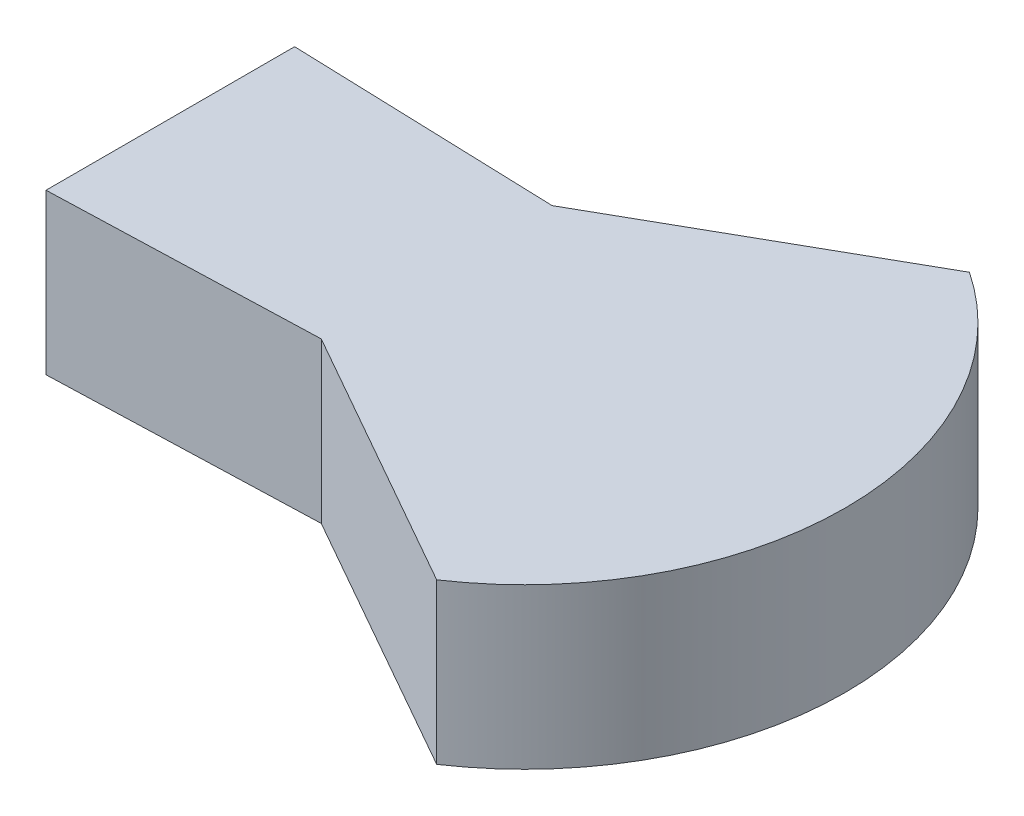
ISO-10303-21;
HEADER;
FILE_DESCRIPTION(('STEP AP214'),'2;1');
FILE_NAME('part.step','',(''),(''),'','','');
FILE_SCHEMA(('AUTOMOTIVE_DESIGN { 1 0 10303 214 1 1 1 1 }'));
ENDSEC;
DATA;
#1=APPLICATION_CONTEXT('core data for automotive mechanical design processes');
#2=APPLICATION_PROTOCOL_DEFINITION('international standard','automotive_design',2000,#1);
#3=PRODUCT_CONTEXT('',#1,'mechanical');
#4=PRODUCT('Part','Part','',(#3));
#5=PRODUCT_RELATED_PRODUCT_CATEGORY('part','',(#4));
#6=PRODUCT_DEFINITION_FORMATION('','',#4);
#7=PRODUCT_DEFINITION_CONTEXT('part definition',#1,'design');
#8=PRODUCT_DEFINITION('design','',#6,#7);
#9=PRODUCT_DEFINITION_SHAPE('','',#8);
#10=(LENGTH_UNIT() NAMED_UNIT(*) SI_UNIT(.MILLI.,.METRE.));
#11=(NAMED_UNIT(*) PLANE_ANGLE_UNIT() SI_UNIT($,.RADIAN.));
#12=(NAMED_UNIT(*) SI_UNIT($,.STERADIAN.) SOLID_ANGLE_UNIT());
#13=UNCERTAINTY_MEASURE_WITH_UNIT(LENGTH_MEASURE(1.E-05),#10,'distance_accuracy_value','');
#14=(GEOMETRIC_REPRESENTATION_CONTEXT(3) GLOBAL_UNCERTAINTY_ASSIGNED_CONTEXT((#13)) GLOBAL_UNIT_ASSIGNED_CONTEXT((#10,
#11,#12)) REPRESENTATION_CONTEXT('',''));
#15=CARTESIAN_POINT('',(0.,0.,0.));
#16=DIRECTION('',(0.,0.,1.));
#17=DIRECTION('',(1.,0.,0.));
#18=AXIS2_PLACEMENT_3D('',#15,#16,#17);
#19=CARTESIAN_POINT('',(7.5,3.,-3.));
#20=DIRECTION('',(-0.0333148302326385,0.,0.999444906979154));
#21=DIRECTION('',(0.999444906979154,0.,0.0333148302326385));
#22=AXIS2_PLACEMENT_3D('',#19,#20,#21);
#23=PLANE('',#22);
#24=DIRECTION('',(0.,-1.,0.));
#25=VECTOR('',#24,1.);
#26=CARTESIAN_POINT('',(0.,11.746427842268,-3.25));
#27=LINE('',#26,#25);
#28=CARTESIAN_POINT('',(0.,3.,-3.25));
#29=VERTEX_POINT('',#28);
#30=CARTESIAN_POINT('',(0.,-1.5,-3.25));
#31=VERTEX_POINT('',#30);
#32=EDGE_CURVE('E113',#29,#31,#27,.T.);
#33=ORIENTED_EDGE('',*,*,#32,.T.);
#34=DIRECTION('',(0.999444906979154,0.,0.0333148302326385));
#35=VECTOR('',#34,1.);
#36=CARTESIAN_POINT('',(-7.5,-1.5,-3.5));
#37=LINE('',#36,#35);
#38=CARTESIAN_POINT('',(-7.5,-1.5,-3.5));
#39=VERTEX_POINT('',#38);
#40=EDGE_CURVE('E164',#39,#31,#37,.T.);
#41=ORIENTED_EDGE('',*,*,#40,.F.);
#42=DIRECTION('',(0.,-1.,0.));
#43=VECTOR('',#42,1.);
#44=CARTESIAN_POINT('',(-7.5,3.,-3.5));
#45=LINE('',#44,#43);
#46=CARTESIAN_POINT('',(-7.5,3.,-3.5));
#47=VERTEX_POINT('',#46);
#48=EDGE_CURVE('E11',#47,#39,#45,.T.);
#49=ORIENTED_EDGE('',*,*,#48,.F.);
#50=DIRECTION('',(-0.999444906979154,0.,-0.0333148302326385));
#51=VECTOR('',#50,1.);
#52=CARTESIAN_POINT('',(7.5,3.,-3.));
#53=LINE('',#52,#51);
#54=EDGE_CURVE('E129',#29,#47,#53,.T.);
#55=ORIENTED_EDGE('',*,*,#54,.F.);
#56=EDGE_LOOP('',(#33,#41,#49,#55));
#57=FACE_BOUND('',#56,.T.);
#58=ADVANCED_FACE('F39',(#57),#23,.F.);
#59=CARTESIAN_POINT('',(-7.5,3.,-3.5));
#60=DIRECTION('',(1.,0.,0.));
#61=DIRECTION('',(0.,0.,-1.));
#62=AXIS2_PLACEMENT_3D('',#59,#60,#61);
#63=PLANE('',#62);
#64=DIRECTION('',(0.,0.,-1.));
#65=VECTOR('',#64,1.);
#66=CARTESIAN_POINT('',(-7.5,-1.5,3.5));
#67=LINE('',#66,#65);
#68=CARTESIAN_POINT('',(-7.5,-1.5,3.5));
#69=VERTEX_POINT('',#68);
#70=EDGE_CURVE('E159',#69,#39,#67,.T.);
#71=ORIENTED_EDGE('',*,*,#70,.F.);
#72=DIRECTION('',(0.,-1.,0.));
#73=VECTOR('',#72,1.);
#74=CARTESIAN_POINT('',(-7.5,3.,3.5));
#75=LINE('',#74,#73);
#76=CARTESIAN_POINT('',(-7.5,3.,3.5));
#77=VERTEX_POINT('',#76);
#78=EDGE_CURVE('E47',#77,#69,#75,.T.);
#79=ORIENTED_EDGE('',*,*,#78,.F.);
#80=DIRECTION('',(0.,0.,1.));
#81=VECTOR('',#80,1.);
#82=CARTESIAN_POINT('',(-7.5,3.,-3.5));
#83=LINE('',#82,#81);
#84=EDGE_CURVE('E138',#47,#77,#83,.T.);
#85=ORIENTED_EDGE('',*,*,#84,.F.);
#86=ORIENTED_EDGE('',*,*,#48,.T.);
#87=EDGE_LOOP('',(#71,#79,#85,#86));
#88=FACE_BOUND('',#87,.T.);
#89=DIRECTION('',(0.,0.,-1.));
#90=VECTOR('',#89,1.);
#91=CARTESIAN_POINT('',(-7.5,1.5,2.375));
#92=LINE('',#91,#90);
#93=CARTESIAN_POINT('',(-7.5,1.5,2.375));
#94=VERTEX_POINT('',#93);
#95=CARTESIAN_POINT('',(-7.5,1.5,-2.375));
#96=VERTEX_POINT('',#95);
#97=EDGE_CURVE('E182',#94,#96,#92,.T.);
#98=ORIENTED_EDGE('',*,*,#97,.F.);
#99=DIRECTION('',(0.,-1.,0.));
#100=VECTOR('',#99,1.);
#101=CARTESIAN_POINT('',(-7.5,1.5,2.375));
#102=LINE('',#101,#100);
#103=CARTESIAN_POINT('',(-7.5,0.,2.375));
#104=VERTEX_POINT('',#103);
#105=EDGE_CURVE('E149',#94,#104,#102,.T.);
#106=ORIENTED_EDGE('',*,*,#105,.T.);
#107=DIRECTION('',(0.,0.,-1.));
#108=VECTOR('',#107,1.);
#109=CARTESIAN_POINT('',(-7.5,0.,3.5));
#110=LINE('',#109,#108);
#111=CARTESIAN_POINT('',(-7.5,0.,-2.375));
#112=VERTEX_POINT('',#111);
#113=EDGE_CURVE('E170',#104,#112,#110,.T.);
#114=ORIENTED_EDGE('',*,*,#113,.T.);
#115=DIRECTION('',(0.,-1.,0.));
#116=VECTOR('',#115,1.);
#117=CARTESIAN_POINT('',(-7.5,1.5,-2.375));
#118=LINE('',#117,#116);
#119=EDGE_CURVE('E207',#96,#112,#118,.T.);
#120=ORIENTED_EDGE('',*,*,#119,.F.);
#121=EDGE_LOOP('',(#98,#106,#114,#120));
#122=FACE_BOUND('',#121,.T.);
#123=ADVANCED_FACE('F160',(#88,#122),#63,.F.);
#124=CARTESIAN_POINT('',(-7.5,3.,3.5));
#125=DIRECTION('',(-0.0333148302326385,0.,-0.999444906979154));
#126=DIRECTION('',(-0.999444906979154,0.,0.0333148302326385));
#127=AXIS2_PLACEMENT_3D('',#124,#125,#126);
#128=PLANE('',#127);
#129=DIRECTION('',(-0.999444906979154,0.,0.0333148302326385));
#130=VECTOR('',#129,1.);
#131=CARTESIAN_POINT('',(7.5,-1.5,3.));
#132=LINE('',#131,#130);
#133=CARTESIAN_POINT('',(0.,-1.5,3.25));
#134=VERTEX_POINT('',#133);
#135=EDGE_CURVE('E59',#134,#69,#132,.T.);
#136=ORIENTED_EDGE('',*,*,#135,.F.);
#137=DIRECTION('',(0.,-1.,0.));
#138=VECTOR('',#137,1.);
#139=CARTESIAN_POINT('',(0.,11.746427842268,3.25));
#140=LINE('',#139,#138);
#141=CARTESIAN_POINT('',(0.,3.,3.25));
#142=VERTEX_POINT('',#141);
#143=EDGE_CURVE('E54',#142,#134,#140,.T.);
#144=ORIENTED_EDGE('',*,*,#143,.F.);
#145=DIRECTION('',(0.999444906979154,0.,-0.0333148302326385));
#146=VECTOR('',#145,1.);
#147=CARTESIAN_POINT('',(-7.5,3.,3.5));
#148=LINE('',#147,#146);
#149=EDGE_CURVE('E143',#77,#142,#148,.T.);
#150=ORIENTED_EDGE('',*,*,#149,.F.);
#151=ORIENTED_EDGE('',*,*,#78,.T.);
#152=EDGE_LOOP('',(#136,#144,#150,#151));
#153=FACE_BOUND('',#152,.T.);
#154=ADVANCED_FACE('F156',(#153),#128,.F.);
#155=CARTESIAN_POINT('',(0.,3.,0.));
#156=DIRECTION('',(0.,1.,0.));
#157=DIRECTION('',(0.,0.,1.));
#158=AXIS2_PLACEMENT_3D('',#155,#156,#157);
#159=PLANE('',#158);
#160=DIRECTION('',(-0.870022185848612,0.,0.49301257198088));
#161=VECTOR('',#160,1.);
#162=CARTESIAN_POINT('',(7.5,3.,-7.5));
#163=LINE('',#162,#161);
#164=CARTESIAN_POINT('',(7.5,3.,-7.5));
#165=VERTEX_POINT('',#164);
#166=EDGE_CURVE('E116',#165,#29,#163,.T.);
#167=ORIENTED_EDGE('',*,*,#166,.T.);
#168=ORIENTED_EDGE('',*,*,#54,.T.);
#169=ORIENTED_EDGE('',*,*,#84,.T.);
#170=ORIENTED_EDGE('',*,*,#149,.T.);
#171=DIRECTION('',(-0.870022185848612,0.,-0.49301257198088));
#172=VECTOR('',#171,1.);
#173=CARTESIAN_POINT('',(7.5,3.,7.5));
#174=LINE('',#173,#172);
#175=CARTESIAN_POINT('',(7.5,3.,7.5));
#176=VERTEX_POINT('',#175);
#177=EDGE_CURVE('E369',#176,#142,#174,.T.);
#178=ORIENTED_EDGE('',*,*,#177,.F.);
#179=CARTESIAN_POINT('',(2.46875,3.,0.));
#180=DIRECTION('',(0.,1.,0.));
#181=DIRECTION('',(0.,0.,1.));
#182=AXIS2_PLACEMENT_3D('',#179,#180,#181);
#183=CIRCLE('',#182,9.03125);
#184=EDGE_CURVE('E132',#176,#165,#183,.T.);
#185=ORIENTED_EDGE('',*,*,#184,.T.);
#186=EDGE_LOOP('',(#167,#168,#169,#170,#178,#185));
#187=FACE_BOUND('',#186,.T.);
#188=ADVANCED_FACE('F128',(#187),#159,.T.);
#189=CARTESIAN_POINT('',(-7.5,1.5,2.375));
#190=DIRECTION('',(0.0468172088377675,0.,0.998903473292911));
#191=DIRECTION('',(0.998903473292911,0.,-0.0468172088377675));
#192=AXIS2_PLACEMENT_3D('',#189,#190,#191);
#193=PLANE('',#192);
#194=DIRECTION('',(-0.998903473292911,0.,0.0468172088377675));
#195=VECTOR('',#194,1.);
#196=CARTESIAN_POINT('',(-7.5,0.,2.375));
#197=LINE('',#196,#195);
#198=CARTESIAN_POINT('',(-0.0323139859956456,0.,2.025));
#199=VERTEX_POINT('',#198);
#200=EDGE_CURVE('E168',#199,#104,#197,.T.);
#201=ORIENTED_EDGE('',*,*,#200,.T.);
#202=ORIENTED_EDGE('',*,*,#105,.F.);
#203=DIRECTION('',(-0.998903473292911,0.,0.0468172088377675));
#204=VECTOR('',#203,1.);
#205=CARTESIAN_POINT('',(-7.5,1.5,2.375));
#206=LINE('',#205,#204);
#207=CARTESIAN_POINT('',(-0.0323139859956456,1.5,2.025));
#208=VERTEX_POINT('',#207);
#209=EDGE_CURVE('E178',#208,#94,#206,.T.);
#210=ORIENTED_EDGE('',*,*,#209,.F.);
#211=DIRECTION('',(0.,-1.,0.));
#212=VECTOR('',#211,1.);
#213=CARTESIAN_POINT('',(-0.0323139859956456,1.5,2.025));
#214=LINE('',#213,#212);
#215=EDGE_CURVE('E139',#208,#199,#214,.T.);
#216=ORIENTED_EDGE('',*,*,#215,.T.);
#217=EDGE_LOOP('',(#201,#202,#210,#216));
#218=FACE_BOUND('',#217,.T.);
#219=ADVANCED_FACE('F217',(#218),#193,.F.);
#220=CARTESIAN_POINT('',(-0.127222904055519,1.5,0.));
#221=DIRECTION('',(0.,-1.,0.));
#222=DIRECTION('',(0.,0.,-1.));
#223=AXIS2_PLACEMENT_3D('',#220,#221,#222);
#224=CYLINDRICAL_SURFACE('',#223,2.02722290405552);
#225=CARTESIAN_POINT('',(-0.127222904055519,0.,0.));
#226=DIRECTION('',(0.,-1.,0.));
#227=DIRECTION('',(0.,0.,-1.));
#228=AXIS2_PLACEMENT_3D('',#225,#226,#227);
#229=CIRCLE('',#228,2.02722290405552);
#230=CARTESIAN_POINT('',(-0.0323139859956449,0.,-2.025));
#231=VERTEX_POINT('',#230);
#232=EDGE_CURVE('E183',#231,#199,#229,.T.);
#233=ORIENTED_EDGE('',*,*,#232,.T.);
#234=ORIENTED_EDGE('',*,*,#215,.F.);
#235=CARTESIAN_POINT('',(-0.127222904055519,1.5,0.));
#236=DIRECTION('',(0.,-1.,0.));
#237=DIRECTION('',(0.,0.,-1.));
#238=AXIS2_PLACEMENT_3D('',#235,#236,#237);
#239=CIRCLE('',#238,2.02722290405552);
#240=CARTESIAN_POINT('',(-0.0323139859956449,1.5,-2.025));
#241=VERTEX_POINT('',#240);
#242=EDGE_CURVE('E191',#241,#208,#239,.T.);
#243=ORIENTED_EDGE('',*,*,#242,.F.);
#244=DIRECTION('',(0.,-1.,0.));
#245=VECTOR('',#244,1.);
#246=CARTESIAN_POINT('',(-0.0323139859956449,1.5,-2.025));
#247=LINE('',#246,#245);
#248=EDGE_CURVE('E146',#241,#231,#247,.T.);
#249=ORIENTED_EDGE('',*,*,#248,.T.);
#250=EDGE_LOOP('',(#233,#234,#243,#249));
#251=FACE_BOUND('',#250,.T.);
#252=ADVANCED_FACE('F222',(#251),#224,.F.);
#253=CARTESIAN_POINT('',(-7.5,1.5,-2.375));
#254=DIRECTION('',(0.046817208837768,0.,-0.998903473292911));
#255=DIRECTION('',(-0.998903473292911,0.,-0.046817208837768));
#256=AXIS2_PLACEMENT_3D('',#253,#254,#255);
#257=PLANE('',#256);
#258=DIRECTION('',(0.998903473292911,0.,0.046817208837768));
#259=VECTOR('',#258,1.);
#260=CARTESIAN_POINT('',(-7.5,0.,-2.375));
#261=LINE('',#260,#259);
#262=EDGE_CURVE('E198',#112,#231,#261,.T.);
#263=ORIENTED_EDGE('',*,*,#262,.T.);
#264=ORIENTED_EDGE('',*,*,#248,.F.);
#265=DIRECTION('',(0.998903473292911,0.,0.046817208837768));
#266=VECTOR('',#265,1.);
#267=CARTESIAN_POINT('',(-7.5,1.5,-2.375));
#268=LINE('',#267,#266);
#269=EDGE_CURVE('E187',#96,#241,#268,.T.);
#270=ORIENTED_EDGE('',*,*,#269,.F.);
#271=ORIENTED_EDGE('',*,*,#119,.T.);
#272=EDGE_LOOP('',(#263,#264,#270,#271));
#273=FACE_BOUND('',#272,.T.);
#274=ADVANCED_FACE('F225',(#273),#257,.F.);
#275=CARTESIAN_POINT('',(-0.127222904055519,1.5,0.));
#276=DIRECTION('',(0.,-1.,0.));
#277=DIRECTION('',(0.,0.,-1.));
#278=AXIS2_PLACEMENT_3D('',#275,#276,#277);
#279=PLANE('',#278);
#280=ORIENTED_EDGE('',*,*,#209,.T.);
#281=ORIENTED_EDGE('',*,*,#97,.T.);
#282=ORIENTED_EDGE('',*,*,#269,.T.);
#283=ORIENTED_EDGE('',*,*,#242,.T.);
#284=EDGE_LOOP('',(#280,#281,#282,#283));
#285=FACE_BOUND('',#284,.T.);
#286=ADVANCED_FACE('F219',(#285),#279,.T.);
#287=CARTESIAN_POINT('',(0.,-1.5,0.));
#288=DIRECTION('',(0.,-1.,0.));
#289=DIRECTION('',(0.,0.,-1.));
#290=AXIS2_PLACEMENT_3D('',#287,#288,#289);
#291=PLANE('',#290);
#292=DIRECTION('',(-0.870022185848612,0.,-0.49301257198088));
#293=VECTOR('',#292,1.);
#294=CARTESIAN_POINT('',(7.5,-1.5,7.5));
#295=LINE('',#294,#293);
#296=CARTESIAN_POINT('',(7.5,-1.5,7.5));
#297=VERTEX_POINT('',#296);
#298=EDGE_CURVE('E134',#297,#134,#295,.T.);
#299=ORIENTED_EDGE('',*,*,#298,.T.);
#300=ORIENTED_EDGE('',*,*,#135,.T.);
#301=ORIENTED_EDGE('',*,*,#70,.T.);
#302=ORIENTED_EDGE('',*,*,#40,.T.);
#303=DIRECTION('',(-0.870022185848612,0.,0.49301257198088));
#304=VECTOR('',#303,1.);
#305=CARTESIAN_POINT('',(7.5,-1.5,-7.5));
#306=LINE('',#305,#304);
#307=CARTESIAN_POINT('',(7.5,-1.5,-7.5));
#308=VERTEX_POINT('',#307);
#309=EDGE_CURVE('E119',#308,#31,#306,.T.);
#310=ORIENTED_EDGE('',*,*,#309,.F.);
#311=CARTESIAN_POINT('',(2.46875,-1.5,0.));
#312=DIRECTION('',(0.,-1.,0.));
#313=DIRECTION('',(0.,0.,-1.));
#314=AXIS2_PLACEMENT_3D('',#311,#312,#313);
#315=CIRCLE('',#314,9.03125);
#316=EDGE_CURVE('E363',#297,#308,#315,.F.);
#317=ORIENTED_EDGE('',*,*,#316,.F.);
#318=EDGE_LOOP('',(#299,#300,#301,#302,#310,#317));
#319=FACE_BOUND('',#318,.T.);
#320=ADVANCED_FACE('F232',(#319),#291,.T.);
#321=CARTESIAN_POINT('',(0.,0.,0.));
#322=DIRECTION('',(0.,-1.,0.));
#323=DIRECTION('',(0.,0.,-1.));
#324=AXIS2_PLACEMENT_3D('',#321,#322,#323);
#325=PLANE('',#324);
#326=ORIENTED_EDGE('',*,*,#200,.F.);
#327=ORIENTED_EDGE('',*,*,#232,.F.);
#328=ORIENTED_EDGE('',*,*,#262,.F.);
#329=ORIENTED_EDGE('',*,*,#113,.F.);
#330=EDGE_LOOP('',(#326,#327,#328,#329));
#331=FACE_BOUND('',#330,.T.);
#332=ADVANCED_FACE('F224',(#331),#325,.F.);
#333=CARTESIAN_POINT('',(2.46875,-17.02417469626,0.));
#334=DIRECTION('',(0.,1.,0.));
#335=DIRECTION('',(0.,0.,1.));
#336=AXIS2_PLACEMENT_3D('',#333,#334,#335);
#337=CYLINDRICAL_SURFACE('',#336,9.03125);
#338=DIRECTION('',(0.,1.,0.));
#339=VECTOR('',#338,1.);
#340=CARTESIAN_POINT('',(7.5,-17.02417469626,7.5));
#341=LINE('',#340,#339);
#342=EDGE_CURVE('E361',#297,#176,#341,.T.);
#343=ORIENTED_EDGE('',*,*,#342,.F.);
#344=ORIENTED_EDGE('',*,*,#316,.T.);
#345=DIRECTION('',(0.,1.,0.));
#346=VECTOR('',#345,1.);
#347=CARTESIAN_POINT('',(7.5,-17.02417469626,-7.5));
#348=LINE('',#347,#346);
#349=EDGE_CURVE('E177',#308,#165,#348,.T.);
#350=ORIENTED_EDGE('',*,*,#349,.T.);
#351=ORIENTED_EDGE('',*,*,#184,.F.);
#352=EDGE_LOOP('',(#343,#344,#350,#351));
#353=FACE_BOUND('',#352,.T.);
#354=ADVANCED_FACE('F269',(#353),#337,.T.);
#355=CARTESIAN_POINT('',(7.5,11.746427842268,7.5));
#356=DIRECTION('',(-0.49301257198088,0.,0.870022185848612));
#357=DIRECTION('',(0.870022185848612,0.,0.49301257198088));
#358=AXIS2_PLACEMENT_3D('',#355,#356,#357);
#359=PLANE('',#358);
#360=ORIENTED_EDGE('',*,*,#342,.T.);
#361=ORIENTED_EDGE('',*,*,#177,.T.);
#362=ORIENTED_EDGE('',*,*,#143,.T.);
#363=ORIENTED_EDGE('',*,*,#298,.F.);
#364=EDGE_LOOP('',(#360,#361,#362,#363));
#365=FACE_BOUND('',#364,.T.);
#366=ADVANCED_FACE('F286',(#365),#359,.T.);
#367=CARTESIAN_POINT('',(7.5,11.746427842268,-7.5));
#368=DIRECTION('',(0.49301257198088,0.,0.870022185848612));
#369=DIRECTION('',(0.870022185848612,0.,-0.49301257198088));
#370=AXIS2_PLACEMENT_3D('',#367,#368,#369);
#371=PLANE('',#370);
#372=ORIENTED_EDGE('',*,*,#166,.F.);
#373=ORIENTED_EDGE('',*,*,#349,.F.);
#374=ORIENTED_EDGE('',*,*,#309,.T.);
#375=ORIENTED_EDGE('',*,*,#32,.F.);
#376=EDGE_LOOP('',(#372,#373,#374,#375));
#377=FACE_BOUND('',#376,.T.);
#378=ADVANCED_FACE('F115',(#377),#371,.F.);
#379=CLOSED_SHELL('',(#58,#123,#154,#188,#219,#252,#274,#286,#320,#332,#354,#366,#378));
#380=MANIFOLD_SOLID_BREP('B2',#379);
#381=ADVANCED_BREP_SHAPE_REPRESENTATION('',(#18,#380),#14);
#382=SHAPE_DEFINITION_REPRESENTATION(#9,#381);
ENDSEC;
END-ISO-10303-21;
